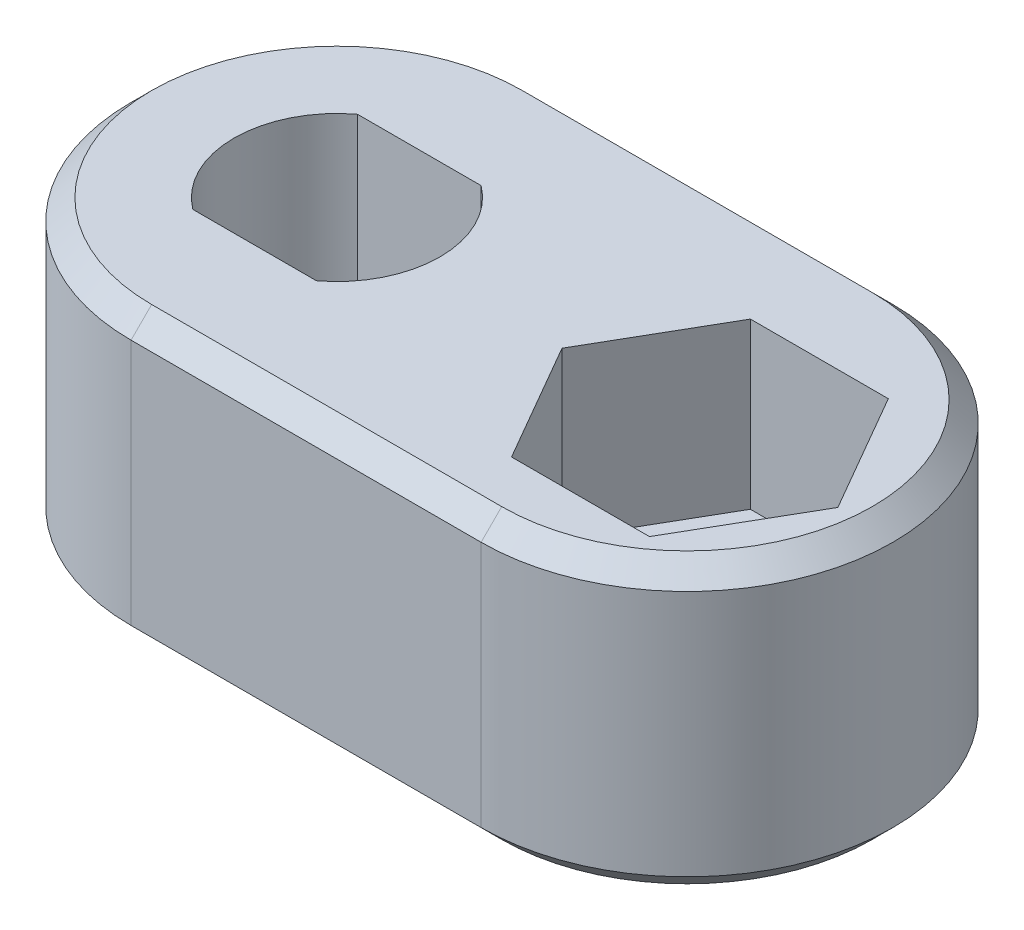
ISO-10303-21;
HEADER;
FILE_DESCRIPTION(('STEP AP214'),'2;1');
FILE_NAME('part.step','',(''),(''),'','','');
FILE_SCHEMA(('AUTOMOTIVE_DESIGN { 1 0 10303 214 1 1 1 1 }'));
ENDSEC;
DATA;
#1=APPLICATION_CONTEXT('core data for automotive mechanical design processes');
#2=APPLICATION_PROTOCOL_DEFINITION('international standard','automotive_design',2000,#1);
#3=PRODUCT_CONTEXT('',#1,'mechanical');
#4=PRODUCT('Part','Part','',(#3));
#5=PRODUCT_RELATED_PRODUCT_CATEGORY('part','',(#4));
#6=PRODUCT_DEFINITION_FORMATION('','',#4);
#7=PRODUCT_DEFINITION_CONTEXT('part definition',#1,'design');
#8=PRODUCT_DEFINITION('design','',#6,#7);
#9=PRODUCT_DEFINITION_SHAPE('','',#8);
#10=(LENGTH_UNIT() NAMED_UNIT(*) SI_UNIT(.MILLI.,.METRE.));
#11=(NAMED_UNIT(*) PLANE_ANGLE_UNIT() SI_UNIT($,.RADIAN.));
#12=(NAMED_UNIT(*) SI_UNIT($,.STERADIAN.) SOLID_ANGLE_UNIT());
#13=UNCERTAINTY_MEASURE_WITH_UNIT(LENGTH_MEASURE(1.E-05),#10,'distance_accuracy_value','');
#14=(GEOMETRIC_REPRESENTATION_CONTEXT(3) GLOBAL_UNCERTAINTY_ASSIGNED_CONTEXT((#13)) GLOBAL_UNIT_ASSIGNED_CONTEXT((#10,
#11,#12)) REPRESENTATION_CONTEXT('',''));
#15=CARTESIAN_POINT('',(0.,0.,0.));
#16=DIRECTION('',(0.,0.,1.));
#17=DIRECTION('',(1.,0.,0.));
#18=AXIS2_PLACEMENT_3D('',#15,#16,#17);
#19=CARTESIAN_POINT('',(5.,7.,0.436816997812618));
#20=DIRECTION('',(0.,1.,0.));
#21=DIRECTION('',(0.,0.,1.));
#22=AXIS2_PLACEMENT_3D('',#19,#20,#21);
#23=CYLINDRICAL_SURFACE('',#22,2.07500000000001);
#24=CARTESIAN_POINT('',(5.,0.,0.436816997812618));
#25=DIRECTION('',(0.,1.,0.));
#26=DIRECTION('',(0.,0.,1.));
#27=AXIS2_PLACEMENT_3D('',#24,#25,#26);
#28=CIRCLE('',#27,2.07500000000001);
#29=CARTESIAN_POINT('',(5.,0.,2.51181699781263));
#30=VERTEX_POINT('',#29);
#31=EDGE_CURVE('E227',#30,#30,#28,.T.);
#32=ORIENTED_EDGE('',*,*,#31,.F.);
#33=EDGE_LOOP('',(#32));
#34=FACE_BOUND('',#33,.T.);
#35=CARTESIAN_POINT('',(5.,3.,0.436816997812618));
#36=DIRECTION('',(0.,1.,0.));
#37=DIRECTION('',(0.,0.,1.));
#38=AXIS2_PLACEMENT_3D('',#35,#36,#37);
#39=CIRCLE('',#38,2.07500000000001);
#40=CARTESIAN_POINT('',(5.,3.,2.51181699781263));
#41=VERTEX_POINT('',#40);
#42=EDGE_CURVE('E219',#41,#41,#39,.F.);
#43=ORIENTED_EDGE('',*,*,#42,.F.);
#44=EDGE_LOOP('',(#43));
#45=FACE_BOUND('',#44,.T.);
#46=ADVANCED_FACE('F36',(#34,#45),#23,.F.);
#47=CARTESIAN_POINT('',(-4.25,7.,0.));
#48=DIRECTION('',(0.,-1.,0.));
#49=DIRECTION('',(0.,0.,-1.));
#50=AXIS2_PLACEMENT_3D('',#47,#48,#49);
#51=CYLINDRICAL_SURFACE('',#50,5.);
#52=DIRECTION('',(0.,-1.,0.));
#53=VECTOR('',#52,1.);
#54=CARTESIAN_POINT('',(-4.25,7.,-5.));
#55=LINE('',#54,#53);
#56=CARTESIAN_POINT('',(-4.25,6.5,-5.));
#57=VERTEX_POINT('',#56);
#58=CARTESIAN_POINT('',(-4.25,0.500000000000004,-5.));
#59=VERTEX_POINT('',#58);
#60=EDGE_CURVE('E258',#57,#59,#55,.T.);
#61=ORIENTED_EDGE('',*,*,#60,.T.);
#62=CARTESIAN_POINT('',(-4.25,0.500000000000004,0.));
#63=DIRECTION('',(0.,1.,0.));
#64=DIRECTION('',(0.,0.,1.));
#65=AXIS2_PLACEMENT_3D('',#62,#63,#64);
#66=CIRCLE('',#65,5.);
#67=CARTESIAN_POINT('',(-4.25,0.500000000000004,5.));
#68=VERTEX_POINT('',#67);
#69=EDGE_CURVE('E301',#59,#68,#66,.T.);
#70=ORIENTED_EDGE('',*,*,#69,.T.);
#71=DIRECTION('',(0.,-1.,0.));
#72=VECTOR('',#71,1.);
#73=CARTESIAN_POINT('',(-4.25,7.,5.));
#74=LINE('',#73,#72);
#75=CARTESIAN_POINT('',(-4.25,6.5,5.));
#76=VERTEX_POINT('',#75);
#77=EDGE_CURVE('E273',#76,#68,#74,.T.);
#78=ORIENTED_EDGE('',*,*,#77,.F.);
#79=CARTESIAN_POINT('',(-4.25,6.5,0.));
#80=DIRECTION('',(0.,1.,0.));
#81=DIRECTION('',(0.,0.,1.));
#82=AXIS2_PLACEMENT_3D('',#79,#80,#81);
#83=CIRCLE('',#82,5.);
#84=EDGE_CURVE('E299',#76,#57,#83,.F.);
#85=ORIENTED_EDGE('',*,*,#84,.T.);
#86=EDGE_LOOP('',(#61,#70,#78,#85));
#87=FACE_BOUND('',#86,.T.);
#88=ADVANCED_FACE('F367',(#87),#51,.T.);
#89=CARTESIAN_POINT('',(-4.25,7.,5.));
#90=DIRECTION('',(0.,0.,-1.));
#91=DIRECTION('',(-1.,0.,0.));
#92=AXIS2_PLACEMENT_3D('',#89,#90,#91);
#93=PLANE('',#92);
#94=ORIENTED_EDGE('',*,*,#77,.T.);
#95=DIRECTION('',(1.,0.,0.));
#96=VECTOR('',#95,1.);
#97=CARTESIAN_POINT('',(-4.25,0.500000000000004,5.));
#98=LINE('',#97,#96);
#99=CARTESIAN_POINT('',(4.25,0.500000000000004,5.));
#100=VERTEX_POINT('',#99);
#101=EDGE_CURVE('E283',#68,#100,#98,.T.);
#102=ORIENTED_EDGE('',*,*,#101,.T.);
#103=DIRECTION('',(0.,-1.,0.));
#104=VECTOR('',#103,1.);
#105=CARTESIAN_POINT('',(4.25,7.,5.));
#106=LINE('',#105,#104);
#107=CARTESIAN_POINT('',(4.25,6.5,5.));
#108=VERTEX_POINT('',#107);
#109=EDGE_CURVE('E270',#108,#100,#106,.T.);
#110=ORIENTED_EDGE('',*,*,#109,.F.);
#111=DIRECTION('',(-1.,0.,0.));
#112=VECTOR('',#111,1.);
#113=CARTESIAN_POINT('',(-4.25,6.5,5.));
#114=LINE('',#113,#112);
#115=EDGE_CURVE('E276',#108,#76,#114,.T.);
#116=ORIENTED_EDGE('',*,*,#115,.T.);
#117=EDGE_LOOP('',(#94,#102,#110,#116));
#118=FACE_BOUND('',#117,.T.);
#119=ADVANCED_FACE('F351',(#118),#93,.F.);
#120=CARTESIAN_POINT('',(4.25,7.,0.));
#121=DIRECTION('',(0.,-1.,0.));
#122=DIRECTION('',(0.,0.,-1.));
#123=AXIS2_PLACEMENT_3D('',#120,#121,#122);
#124=CYLINDRICAL_SURFACE('',#123,5.);
#125=ORIENTED_EDGE('',*,*,#109,.T.);
#126=CARTESIAN_POINT('',(4.25,0.500000000000004,0.));
#127=DIRECTION('',(0.,1.,0.));
#128=DIRECTION('',(0.,0.,1.));
#129=AXIS2_PLACEMENT_3D('',#126,#127,#128);
#130=CIRCLE('',#129,5.);
#131=CARTESIAN_POINT('',(4.25,0.500000000000004,-5.));
#132=VERTEX_POINT('',#131);
#133=EDGE_CURVE('E297',#100,#132,#130,.T.);
#134=ORIENTED_EDGE('',*,*,#133,.T.);
#135=DIRECTION('',(0.,-1.,0.));
#136=VECTOR('',#135,1.);
#137=CARTESIAN_POINT('',(4.25,7.,-5.));
#138=LINE('',#137,#136);
#139=CARTESIAN_POINT('',(4.25,6.5,-5.));
#140=VERTEX_POINT('',#139);
#141=EDGE_CURVE('E267',#140,#132,#138,.T.);
#142=ORIENTED_EDGE('',*,*,#141,.F.);
#143=CARTESIAN_POINT('',(4.25,6.5,0.));
#144=DIRECTION('',(0.,1.,0.));
#145=DIRECTION('',(0.,0.,1.));
#146=AXIS2_PLACEMENT_3D('',#143,#144,#145);
#147=CIRCLE('',#146,5.);
#148=EDGE_CURVE('E295',#140,#108,#147,.F.);
#149=ORIENTED_EDGE('',*,*,#148,.T.);
#150=EDGE_LOOP('',(#125,#134,#142,#149));
#151=FACE_BOUND('',#150,.T.);
#152=ADVANCED_FACE('F341',(#151),#124,.T.);
#153=CARTESIAN_POINT('',(-4.25,7.,-5.));
#154=DIRECTION('',(0.,0.,1.));
#155=DIRECTION('',(1.,0.,0.));
#156=AXIS2_PLACEMENT_3D('',#153,#154,#155);
#157=PLANE('',#156);
#158=ORIENTED_EDGE('',*,*,#141,.T.);
#159=DIRECTION('',(-1.,0.,0.));
#160=VECTOR('',#159,1.);
#161=CARTESIAN_POINT('',(-4.25,0.500000000000004,-5.));
#162=LINE('',#161,#160);
#163=EDGE_CURVE('E305',#132,#59,#162,.T.);
#164=ORIENTED_EDGE('',*,*,#163,.T.);
#165=ORIENTED_EDGE('',*,*,#60,.F.);
#166=DIRECTION('',(1.,0.,0.));
#167=VECTOR('',#166,1.);
#168=CARTESIAN_POINT('',(4.25,6.5,-5.));
#169=LINE('',#168,#167);
#170=EDGE_CURVE('E303',#57,#140,#169,.T.);
#171=ORIENTED_EDGE('',*,*,#170,.T.);
#172=EDGE_LOOP('',(#158,#164,#165,#171));
#173=FACE_BOUND('',#172,.T.);
#174=ADVANCED_FACE('F338',(#173),#157,.F.);
#175=CARTESIAN_POINT('',(-4.25,7.,0.));
#176=DIRECTION('',(0.,1.,0.));
#177=DIRECTION('',(0.,0.,1.));
#178=AXIS2_PLACEMENT_3D('',#175,#176,#177);
#179=PLANE('',#178);
#180=CARTESIAN_POINT('',(-4.25,7.,0.));
#181=DIRECTION('',(0.,1.,0.));
#182=DIRECTION('',(0.,0.,1.));
#183=AXIS2_PLACEMENT_3D('',#180,#181,#182);
#184=CIRCLE('',#183,4.5);
#185=CARTESIAN_POINT('',(-4.25,7.,-4.5));
#186=VERTEX_POINT('',#185);
#187=CARTESIAN_POINT('',(-4.25,7.,4.5));
#188=VERTEX_POINT('',#187);
#189=EDGE_CURVE('E61',#186,#188,#184,.T.);
#190=ORIENTED_EDGE('',*,*,#189,.T.);
#191=DIRECTION('',(1.,0.,0.));
#192=VECTOR('',#191,1.);
#193=CARTESIAN_POINT('',(4.25,7.,4.49999999999999));
#194=LINE('',#193,#192);
#195=CARTESIAN_POINT('',(4.25,7.,4.49999999999999));
#196=VERTEX_POINT('',#195);
#197=EDGE_CURVE('E11',#188,#196,#194,.T.);
#198=ORIENTED_EDGE('',*,*,#197,.T.);
#199=CARTESIAN_POINT('',(4.25,7.,0.));
#200=DIRECTION('',(0.,1.,0.));
#201=DIRECTION('',(0.,0.,1.));
#202=AXIS2_PLACEMENT_3D('',#199,#200,#201);
#203=CIRCLE('',#202,4.5);
#204=CARTESIAN_POINT('',(4.25,7.,-4.5));
#205=VERTEX_POINT('',#204);
#206=EDGE_CURVE('E46',#196,#205,#203,.T.);
#207=ORIENTED_EDGE('',*,*,#206,.T.);
#208=DIRECTION('',(-1.,0.,0.));
#209=VECTOR('',#208,1.);
#210=CARTESIAN_POINT('',(-4.25,7.,-4.5));
#211=LINE('',#210,#209);
#212=EDGE_CURVE('E307',#205,#186,#211,.T.);
#213=ORIENTED_EDGE('',*,*,#212,.T.);
#214=EDGE_LOOP('',(#190,#198,#207,#213));
#215=FACE_BOUND('',#214,.T.);
#216=DIRECTION('',(0.5,0.,-0.866025403784439));
#217=VECTOR('',#216,1.);
#218=CARTESIAN_POINT('',(6.67431578064445,7.,3.33681699781236));
#219=LINE('',#218,#217);
#220=CARTESIAN_POINT('',(6.67431578064445,7.,3.33681699781236));
#221=VERTEX_POINT('',#220);
#222=CARTESIAN_POINT('',(8.34863156129436,7.,0.436816997812368));
#223=VERTEX_POINT('',#222);
#224=EDGE_CURVE('E173',#221,#223,#219,.T.);
#225=ORIENTED_EDGE('',*,*,#224,.F.);
#226=DIRECTION('',(1.,0.,0.));
#227=VECTOR('',#226,1.);
#228=CARTESIAN_POINT('',(3.32568421934462,7.,3.33681699781236));
#229=LINE('',#228,#227);
#230=CARTESIAN_POINT('',(3.32568421934462,7.,3.33681699781236));
#231=VERTEX_POINT('',#230);
#232=EDGE_CURVE('E192',#231,#221,#229,.T.);
#233=ORIENTED_EDGE('',*,*,#232,.F.);
#234=DIRECTION('',(0.5,0.,0.866025403784439));
#235=VECTOR('',#234,1.);
#236=CARTESIAN_POINT('',(1.65136843869471,7.,0.436816997812369));
#237=LINE('',#236,#235);
#238=CARTESIAN_POINT('',(1.65136843869471,7.,0.436816997812369));
#239=VERTEX_POINT('',#238);
#240=EDGE_CURVE('E195',#239,#231,#237,.T.);
#241=ORIENTED_EDGE('',*,*,#240,.F.);
#242=DIRECTION('',(-0.5,0.,0.866025403784439));
#243=VECTOR('',#242,1.);
#244=CARTESIAN_POINT('',(3.32568421934462,7.,-2.46318300218763));
#245=LINE('',#244,#243);
#246=CARTESIAN_POINT('',(3.32568421934462,7.,-2.46318300218763));
#247=VERTEX_POINT('',#246);
#248=EDGE_CURVE('E212',#247,#239,#245,.T.);
#249=ORIENTED_EDGE('',*,*,#248,.F.);
#250=DIRECTION('',(-1.,0.,0.));
#251=VECTOR('',#250,1.);
#252=CARTESIAN_POINT('',(6.67431578064445,7.,-2.46318300218763));
#253=LINE('',#252,#251);
#254=CARTESIAN_POINT('',(6.67431578064445,7.,-2.46318300218763));
#255=VERTEX_POINT('',#254);
#256=EDGE_CURVE('E209',#255,#247,#253,.T.);
#257=ORIENTED_EDGE('',*,*,#256,.F.);
#258=DIRECTION('',(-0.5,0.,-0.866025403784439));
#259=VECTOR('',#258,1.);
#260=CARTESIAN_POINT('',(8.34863156129436,7.,0.436816997812367));
#261=LINE('',#260,#259);
#262=EDGE_CURVE('E206',#223,#255,#261,.T.);
#263=ORIENTED_EDGE('',*,*,#262,.F.);
#264=EDGE_LOOP('',(#225,#233,#241,#249,#257,#263));
#265=FACE_BOUND('',#264,.T.);
#266=CARTESIAN_POINT('',(-4.25,7.,0.));
#267=DIRECTION('',(0.,1.,0.));
#268=DIRECTION('',(0.,0.,1.));
#269=AXIS2_PLACEMENT_3D('',#266,#267,#268);
#270=CIRCLE('',#269,2.5);
#271=CARTESIAN_POINT('',(-5.75,7.,-2.));
#272=VERTEX_POINT('',#271);
#273=CARTESIAN_POINT('',(-5.75,7.,2.));
#274=VERTEX_POINT('',#273);
#275=EDGE_CURVE('E248',#272,#274,#270,.T.);
#276=ORIENTED_EDGE('',*,*,#275,.F.);
#277=DIRECTION('',(1.,0.,0.));
#278=VECTOR('',#277,1.);
#279=CARTESIAN_POINT('',(0.,7.,-2.));
#280=LINE('',#279,#278);
#281=CARTESIAN_POINT('',(-2.75,7.,-2.));
#282=VERTEX_POINT('',#281);
#283=EDGE_CURVE('E241',#272,#282,#280,.T.);
#284=ORIENTED_EDGE('',*,*,#283,.T.);
#285=CARTESIAN_POINT('',(-2.75,7.,2.));
#286=VERTEX_POINT('',#285);
#287=EDGE_CURVE('E251',#286,#282,#270,.T.);
#288=ORIENTED_EDGE('',*,*,#287,.F.);
#289=DIRECTION('',(1.,0.,0.));
#290=VECTOR('',#289,1.);
#291=CARTESIAN_POINT('',(0.,7.,2.));
#292=LINE('',#291,#290);
#293=EDGE_CURVE('E250',#274,#286,#292,.T.);
#294=ORIENTED_EDGE('',*,*,#293,.F.);
#295=EDGE_LOOP('',(#276,#284,#288,#294));
#296=FACE_BOUND('',#295,.T.);
#297=ADVANCED_FACE('F416',(#215,#265,#296),#179,.T.);
#298=CARTESIAN_POINT('',(-4.25,0.,0.));
#299=DIRECTION('',(0.,1.,0.));
#300=DIRECTION('',(0.,0.,1.));
#301=AXIS2_PLACEMENT_3D('',#298,#299,#300);
#302=PLANE('',#301);
#303=CARTESIAN_POINT('',(4.25,0.,0.));
#304=DIRECTION('',(0.,1.,0.));
#305=DIRECTION('',(0.,0.,1.));
#306=AXIS2_PLACEMENT_3D('',#303,#304,#305);
#307=CIRCLE('',#306,4.5);
#308=CARTESIAN_POINT('',(4.25,0.,-4.5));
#309=VERTEX_POINT('',#308);
#310=CARTESIAN_POINT('',(4.25,0.,4.49999999999999));
#311=VERTEX_POINT('',#310);
#312=EDGE_CURVE('E290',#309,#311,#307,.F.);
#313=ORIENTED_EDGE('',*,*,#312,.T.);
#314=DIRECTION('',(-1.,0.,0.));
#315=VECTOR('',#314,1.);
#316=CARTESIAN_POINT('',(-4.25,0.,4.5));
#317=LINE('',#316,#315);
#318=CARTESIAN_POINT('',(-4.25,0.,4.5));
#319=VERTEX_POINT('',#318);
#320=EDGE_CURVE('E292',#311,#319,#317,.T.);
#321=ORIENTED_EDGE('',*,*,#320,.T.);
#322=CARTESIAN_POINT('',(-4.25,0.,0.));
#323=DIRECTION('',(0.,1.,0.));
#324=DIRECTION('',(0.,0.,1.));
#325=AXIS2_PLACEMENT_3D('',#322,#323,#324);
#326=CIRCLE('',#325,4.5);
#327=CARTESIAN_POINT('',(-4.25,0.,-4.5));
#328=VERTEX_POINT('',#327);
#329=EDGE_CURVE('E288',#319,#328,#326,.F.);
#330=ORIENTED_EDGE('',*,*,#329,.T.);
#331=DIRECTION('',(1.,0.,0.));
#332=VECTOR('',#331,1.);
#333=CARTESIAN_POINT('',(-4.25,0.,-4.5));
#334=LINE('',#333,#332);
#335=EDGE_CURVE('E286',#328,#309,#334,.T.);
#336=ORIENTED_EDGE('',*,*,#335,.T.);
#337=EDGE_LOOP('',(#313,#321,#330,#336));
#338=FACE_BOUND('',#337,.T.);
#339=ORIENTED_EDGE('',*,*,#31,.T.);
#340=EDGE_LOOP('',(#339));
#341=FACE_BOUND('',#340,.T.);
#342=CARTESIAN_POINT('',(-4.25,0.,0.));
#343=DIRECTION('',(0.,-1.,0.));
#344=DIRECTION('',(0.,0.,-1.));
#345=AXIS2_PLACEMENT_3D('',#342,#343,#344);
#346=CIRCLE('',#345,3.36);
#347=CARTESIAN_POINT('',(-4.25,0.,-3.36));
#348=VERTEX_POINT('',#347);
#349=EDGE_CURVE('E230',#348,#348,#346,.T.);
#350=ORIENTED_EDGE('',*,*,#349,.F.);
#351=EDGE_LOOP('',(#350));
#352=FACE_BOUND('',#351,.T.);
#353=ADVANCED_FACE('F359',(#338,#341,#352),#302,.F.);
#354=CARTESIAN_POINT('',(-4.25,3.,0.));
#355=DIRECTION('',(0.,1.,0.));
#356=DIRECTION('',(0.,0.,1.));
#357=AXIS2_PLACEMENT_3D('',#354,#355,#356);
#358=CYLINDRICAL_SURFACE('',#357,2.5);
#359=ORIENTED_EDGE('',*,*,#275,.T.);
#360=DIRECTION('',(0.,1.,0.));
#361=VECTOR('',#360,1.);
#362=CARTESIAN_POINT('',(-5.75,3.,2.));
#363=LINE('',#362,#361);
#364=CARTESIAN_POINT('',(-5.75,3.,2.));
#365=VERTEX_POINT('',#364);
#366=EDGE_CURVE('E247',#365,#274,#363,.T.);
#367=ORIENTED_EDGE('',*,*,#366,.F.);
#368=CARTESIAN_POINT('',(-4.25,3.,0.));
#369=DIRECTION('',(0.,1.,0.));
#370=DIRECTION('',(0.,0.,1.));
#371=AXIS2_PLACEMENT_3D('',#368,#369,#370);
#372=CIRCLE('',#371,2.5);
#373=CARTESIAN_POINT('',(-5.75,3.,-2.));
#374=VERTEX_POINT('',#373);
#375=EDGE_CURVE('E237',#374,#365,#372,.T.);
#376=ORIENTED_EDGE('',*,*,#375,.F.);
#377=DIRECTION('',(0.,1.,0.));
#378=VECTOR('',#377,1.);
#379=CARTESIAN_POINT('',(-5.75,3.,-2.));
#380=LINE('',#379,#378);
#381=EDGE_CURVE('E256',#374,#272,#380,.T.);
#382=ORIENTED_EDGE('',*,*,#381,.T.);
#383=EDGE_LOOP('',(#359,#367,#376,#382));
#384=FACE_BOUND('',#383,.T.);
#385=ADVANCED_FACE('F408',(#384),#358,.F.);
#386=CARTESIAN_POINT('',(0.,3.,-2.));
#387=DIRECTION('',(0.,0.,1.));
#388=DIRECTION('',(1.,0.,0.));
#389=AXIS2_PLACEMENT_3D('',#386,#387,#388);
#390=PLANE('',#389);
#391=ORIENTED_EDGE('',*,*,#283,.F.);
#392=ORIENTED_EDGE('',*,*,#381,.F.);
#393=DIRECTION('',(1.,0.,0.));
#394=VECTOR('',#393,1.);
#395=CARTESIAN_POINT('',(0.,3.,-2.));
#396=LINE('',#395,#394);
#397=CARTESIAN_POINT('',(-2.75,3.,-2.));
#398=VERTEX_POINT('',#397);
#399=EDGE_CURVE('E245',#374,#398,#396,.T.);
#400=ORIENTED_EDGE('',*,*,#399,.T.);
#401=DIRECTION('',(0.,1.,0.));
#402=VECTOR('',#401,1.);
#403=CARTESIAN_POINT('',(-2.75,3.,-2.));
#404=LINE('',#403,#402);
#405=EDGE_CURVE('E259',#398,#282,#404,.T.);
#406=ORIENTED_EDGE('',*,*,#405,.T.);
#407=EDGE_LOOP('',(#391,#392,#400,#406));
#408=FACE_BOUND('',#407,.T.);
#409=ADVANCED_FACE('F404',(#408),#390,.T.);
#410=ORIENTED_EDGE('',*,*,#287,.T.);
#411=ORIENTED_EDGE('',*,*,#405,.F.);
#412=CARTESIAN_POINT('',(-2.75,3.,2.));
#413=VERTEX_POINT('',#412);
#414=EDGE_CURVE('E242',#413,#398,#372,.T.);
#415=ORIENTED_EDGE('',*,*,#414,.F.);
#416=DIRECTION('',(0.,1.,0.));
#417=VECTOR('',#416,1.);
#418=CARTESIAN_POINT('',(-2.75,3.,2.));
#419=LINE('',#418,#417);
#420=EDGE_CURVE('E261',#413,#286,#419,.T.);
#421=ORIENTED_EDGE('',*,*,#420,.T.);
#422=EDGE_LOOP('',(#410,#411,#415,#421));
#423=FACE_BOUND('',#422,.T.);
#424=ADVANCED_FACE('F407',(#423),#358,.F.);
#425=CARTESIAN_POINT('',(0.,3.,2.));
#426=DIRECTION('',(0.,0.,1.));
#427=DIRECTION('',(1.,0.,0.));
#428=AXIS2_PLACEMENT_3D('',#425,#426,#427);
#429=PLANE('',#428);
#430=ORIENTED_EDGE('',*,*,#293,.T.);
#431=ORIENTED_EDGE('',*,*,#420,.F.);
#432=DIRECTION('',(1.,0.,0.));
#433=VECTOR('',#432,1.);
#434=CARTESIAN_POINT('',(0.,3.,2.));
#435=LINE('',#434,#433);
#436=EDGE_CURVE('E240',#365,#413,#435,.T.);
#437=ORIENTED_EDGE('',*,*,#436,.F.);
#438=ORIENTED_EDGE('',*,*,#366,.T.);
#439=EDGE_LOOP('',(#430,#431,#437,#438));
#440=FACE_BOUND('',#439,.T.);
#441=ADVANCED_FACE('F402',(#440),#429,.F.);
#442=CARTESIAN_POINT('',(0.,3.,0.));
#443=DIRECTION('',(0.,1.,0.));
#444=DIRECTION('',(0.,0.,1.));
#445=AXIS2_PLACEMENT_3D('',#442,#443,#444);
#446=PLANE('',#445);
#447=CARTESIAN_POINT('',(-4.25,3.,0.));
#448=DIRECTION('',(0.,1.,0.));
#449=DIRECTION('',(0.,0.,1.));
#450=AXIS2_PLACEMENT_3D('',#447,#448,#449);
#451=CIRCLE('',#450,1.7);
#452=CARTESIAN_POINT('',(-4.25,3.,1.7));
#453=VERTEX_POINT('',#452);
#454=EDGE_CURVE('E236',#453,#453,#451,.T.);
#455=ORIENTED_EDGE('',*,*,#454,.F.);
#456=EDGE_LOOP('',(#455));
#457=FACE_BOUND('',#456,.T.);
#458=ORIENTED_EDGE('',*,*,#375,.T.);
#459=ORIENTED_EDGE('',*,*,#436,.T.);
#460=ORIENTED_EDGE('',*,*,#414,.T.);
#461=ORIENTED_EDGE('',*,*,#399,.F.);
#462=EDGE_LOOP('',(#458,#459,#460,#461));
#463=FACE_BOUND('',#462,.T.);
#464=ADVANCED_FACE('F398',(#457,#463),#446,.T.);
#465=CARTESIAN_POINT('',(-4.25,0.,0.));
#466=DIRECTION('',(0.,-1.,0.));
#467=DIRECTION('',(0.,0.,-1.));
#468=AXIS2_PLACEMENT_3D('',#465,#466,#467);
#469=CYLINDRICAL_SURFACE('',#468,1.7);
#470=ORIENTED_EDGE('',*,*,#454,.T.);
#471=EDGE_LOOP('',(#470));
#472=FACE_BOUND('',#471,.T.);
#473=CARTESIAN_POINT('',(-4.25,1.66,0.));
#474=DIRECTION('',(0.,-1.,0.));
#475=DIRECTION('',(0.,0.,-1.));
#476=AXIS2_PLACEMENT_3D('',#473,#474,#475);
#477=CIRCLE('',#476,1.7);
#478=CARTESIAN_POINT('',(-4.25,1.66,-1.7));
#479=VERTEX_POINT('',#478);
#480=EDGE_CURVE('E233',#479,#479,#477,.T.);
#481=ORIENTED_EDGE('',*,*,#480,.T.);
#482=EDGE_LOOP('',(#481));
#483=FACE_BOUND('',#482,.T.);
#484=ADVANCED_FACE('F394',(#472,#483),#469,.F.);
#485=CARTESIAN_POINT('',(-4.25,0.,0.));
#486=DIRECTION('',(0.,-1.,0.));
#487=DIRECTION('',(0.,0.,-1.));
#488=AXIS2_PLACEMENT_3D('',#485,#486,#487);
#489=CONICAL_SURFACE('',#488,3.36,0.785398163397448);
#490=ORIENTED_EDGE('',*,*,#480,.F.);
#491=EDGE_LOOP('',(#490));
#492=FACE_BOUND('',#491,.T.);
#493=ORIENTED_EDGE('',*,*,#349,.T.);
#494=EDGE_LOOP('',(#493));
#495=FACE_BOUND('',#494,.T.);
#496=ADVANCED_FACE('F391',(#492,#495),#489,.F.);
#497=CARTESIAN_POINT('',(0.,3.,0.));
#498=DIRECTION('',(0.,1.,0.));
#499=DIRECTION('',(0.,0.,1.));
#500=AXIS2_PLACEMENT_3D('',#497,#498,#499);
#501=PLANE('',#500);
#502=DIRECTION('',(0.5,0.,-0.866025403784439));
#503=VECTOR('',#502,1.);
#504=CARTESIAN_POINT('',(6.67431578064445,3.,3.33681699781236));
#505=LINE('',#504,#503);
#506=CARTESIAN_POINT('',(6.67431578064445,3.,3.33681699781236));
#507=VERTEX_POINT('',#506);
#508=CARTESIAN_POINT('',(8.34863156129436,3.,0.436816997812367));
#509=VERTEX_POINT('',#508);
#510=EDGE_CURVE('E170',#507,#509,#505,.T.);
#511=ORIENTED_EDGE('',*,*,#510,.T.);
#512=DIRECTION('',(-0.5,0.,-0.866025403784439));
#513=VECTOR('',#512,1.);
#514=CARTESIAN_POINT('',(8.34863156129436,3.,0.436816997812367));
#515=LINE('',#514,#513);
#516=CARTESIAN_POINT('',(6.67431578064445,3.,-2.46318300218763));
#517=VERTEX_POINT('',#516);
#518=EDGE_CURVE('E181',#509,#517,#515,.T.);
#519=ORIENTED_EDGE('',*,*,#518,.T.);
#520=DIRECTION('',(-1.,0.,0.));
#521=VECTOR('',#520,1.);
#522=CARTESIAN_POINT('',(6.67431578064445,3.,-2.46318300218763));
#523=LINE('',#522,#521);
#524=CARTESIAN_POINT('',(3.32568421934462,3.,-2.46318300218763));
#525=VERTEX_POINT('',#524);
#526=EDGE_CURVE('E186',#517,#525,#523,.T.);
#527=ORIENTED_EDGE('',*,*,#526,.T.);
#528=DIRECTION('',(-0.5,0.,0.866025403784439));
#529=VECTOR('',#528,1.);
#530=CARTESIAN_POINT('',(3.32568421934462,3.,-2.46318300218763));
#531=LINE('',#530,#529);
#532=CARTESIAN_POINT('',(1.65136843869471,3.,0.436816997812369));
#533=VERTEX_POINT('',#532);
#534=EDGE_CURVE('E199',#525,#533,#531,.T.);
#535=ORIENTED_EDGE('',*,*,#534,.T.);
#536=DIRECTION('',(0.5,0.,0.866025403784439));
#537=VECTOR('',#536,1.);
#538=CARTESIAN_POINT('',(1.65136843869471,3.,0.436816997812369));
#539=LINE('',#538,#537);
#540=CARTESIAN_POINT('',(3.32568421934462,3.,3.33681699781236));
#541=VERTEX_POINT('',#540);
#542=EDGE_CURVE('E202',#533,#541,#539,.T.);
#543=ORIENTED_EDGE('',*,*,#542,.T.);
#544=DIRECTION('',(1.,0.,0.));
#545=VECTOR('',#544,1.);
#546=CARTESIAN_POINT('',(3.32568421934462,3.,3.33681699781236));
#547=LINE('',#546,#545);
#548=EDGE_CURVE('E178',#541,#507,#547,.T.);
#549=ORIENTED_EDGE('',*,*,#548,.T.);
#550=EDGE_LOOP('',(#511,#519,#527,#535,#543,#549));
#551=FACE_BOUND('',#550,.T.);
#552=ORIENTED_EDGE('',*,*,#42,.T.);
#553=EDGE_LOOP('',(#552));
#554=FACE_BOUND('',#553,.T.);
#555=ADVANCED_FACE('F188',(#551,#554),#501,.T.);
#556=CARTESIAN_POINT('',(6.67431578064445,3.,3.33681699781236));
#557=DIRECTION('',(0.866025403784439,0.,0.5));
#558=DIRECTION('',(0.5,0.,-0.866025403784439));
#559=AXIS2_PLACEMENT_3D('',#556,#557,#558);
#560=PLANE('',#559);
#561=ORIENTED_EDGE('',*,*,#224,.T.);
#562=DIRECTION('',(0.,1.,0.));
#563=VECTOR('',#562,1.);
#564=CARTESIAN_POINT('',(8.34863156129436,3.,0.436816997812367));
#565=LINE('',#564,#563);
#566=EDGE_CURVE('E166',#509,#223,#565,.T.);
#567=ORIENTED_EDGE('',*,*,#566,.F.);
#568=ORIENTED_EDGE('',*,*,#510,.F.);
#569=DIRECTION('',(0.,1.,0.));
#570=VECTOR('',#569,1.);
#571=CARTESIAN_POINT('',(6.67431578064445,3.,3.33681699781236));
#572=LINE('',#571,#570);
#573=EDGE_CURVE('E217',#507,#221,#572,.T.);
#574=ORIENTED_EDGE('',*,*,#573,.T.);
#575=EDGE_LOOP('',(#561,#567,#568,#574));
#576=FACE_BOUND('',#575,.T.);
#577=ADVANCED_FACE('F168',(#576),#560,.F.);
#578=CARTESIAN_POINT('',(3.32568421934462,3.,3.33681699781236));
#579=DIRECTION('',(0.,0.,1.));
#580=DIRECTION('',(1.,0.,0.));
#581=AXIS2_PLACEMENT_3D('',#578,#579,#580);
#582=PLANE('',#581);
#583=ORIENTED_EDGE('',*,*,#232,.T.);
#584=ORIENTED_EDGE('',*,*,#573,.F.);
#585=ORIENTED_EDGE('',*,*,#548,.F.);
#586=DIRECTION('',(0.,1.,0.));
#587=VECTOR('',#586,1.);
#588=CARTESIAN_POINT('',(3.32568421934462,3.,3.33681699781236));
#589=LINE('',#588,#587);
#590=EDGE_CURVE('E220',#541,#231,#589,.T.);
#591=ORIENTED_EDGE('',*,*,#590,.T.);
#592=EDGE_LOOP('',(#583,#584,#585,#591));
#593=FACE_BOUND('',#592,.T.);
#594=ADVANCED_FACE('F553',(#593),#582,.F.);
#595=CARTESIAN_POINT('',(1.65136843869471,3.,0.436816997812369));
#596=DIRECTION('',(-0.866025403784439,0.,0.5));
#597=DIRECTION('',(0.5,0.,0.866025403784439));
#598=AXIS2_PLACEMENT_3D('',#595,#596,#597);
#599=PLANE('',#598);
#600=ORIENTED_EDGE('',*,*,#240,.T.);
#601=ORIENTED_EDGE('',*,*,#590,.F.);
#602=ORIENTED_EDGE('',*,*,#542,.F.);
#603=DIRECTION('',(0.,1.,0.));
#604=VECTOR('',#603,1.);
#605=CARTESIAN_POINT('',(1.65136843869471,3.,0.436816997812369));
#606=LINE('',#605,#604);
#607=EDGE_CURVE('E222',#533,#239,#606,.T.);
#608=ORIENTED_EDGE('',*,*,#607,.T.);
#609=EDGE_LOOP('',(#600,#601,#602,#608));
#610=FACE_BOUND('',#609,.T.);
#611=ADVANCED_FACE('F543',(#610),#599,.F.);
#612=CARTESIAN_POINT('',(3.32568421934462,3.,-2.46318300218763));
#613=DIRECTION('',(-0.866025403784439,0.,-0.5));
#614=DIRECTION('',(-0.5,0.,0.866025403784439));
#615=AXIS2_PLACEMENT_3D('',#612,#613,#614);
#616=PLANE('',#615);
#617=ORIENTED_EDGE('',*,*,#248,.T.);
#618=ORIENTED_EDGE('',*,*,#607,.F.);
#619=ORIENTED_EDGE('',*,*,#534,.F.);
#620=DIRECTION('',(0.,1.,0.));
#621=VECTOR('',#620,1.);
#622=CARTESIAN_POINT('',(3.32568421934462,3.,-2.46318300218763));
#623=LINE('',#622,#621);
#624=EDGE_CURVE('E224',#525,#247,#623,.T.);
#625=ORIENTED_EDGE('',*,*,#624,.T.);
#626=EDGE_LOOP('',(#617,#618,#619,#625));
#627=FACE_BOUND('',#626,.T.);
#628=ADVANCED_FACE('F533',(#627),#616,.F.);
#629=CARTESIAN_POINT('',(6.67431578064445,3.,-2.46318300218763));
#630=DIRECTION('',(0.,0.,-1.));
#631=DIRECTION('',(-1.,0.,0.));
#632=AXIS2_PLACEMENT_3D('',#629,#630,#631);
#633=PLANE('',#632);
#634=ORIENTED_EDGE('',*,*,#256,.T.);
#635=ORIENTED_EDGE('',*,*,#624,.F.);
#636=ORIENTED_EDGE('',*,*,#526,.F.);
#637=DIRECTION('',(0.,1.,0.));
#638=VECTOR('',#637,1.);
#639=CARTESIAN_POINT('',(6.67431578064445,3.,-2.46318300218763));
#640=LINE('',#639,#638);
#641=EDGE_CURVE('E177',#517,#255,#640,.T.);
#642=ORIENTED_EDGE('',*,*,#641,.T.);
#643=EDGE_LOOP('',(#634,#635,#636,#642));
#644=FACE_BOUND('',#643,.T.);
#645=ADVANCED_FACE('F525',(#644),#633,.F.);
#646=CARTESIAN_POINT('',(8.34863156129436,3.,0.436816997812367));
#647=DIRECTION('',(0.866025403784439,0.,-0.5));
#648=DIRECTION('',(-0.5,0.,-0.866025403784439));
#649=AXIS2_PLACEMENT_3D('',#646,#647,#648);
#650=PLANE('',#649);
#651=ORIENTED_EDGE('',*,*,#262,.T.);
#652=ORIENTED_EDGE('',*,*,#641,.F.);
#653=ORIENTED_EDGE('',*,*,#518,.F.);
#654=ORIENTED_EDGE('',*,*,#566,.T.);
#655=EDGE_LOOP('',(#651,#652,#653,#654));
#656=FACE_BOUND('',#655,.T.);
#657=ADVANCED_FACE('F182',(#656),#650,.F.);
#658=CARTESIAN_POINT('',(-4.25,0.500000000000004,-5.));
#659=DIRECTION('',(0.,0.707106781186547,0.707106781186547));
#660=DIRECTION('',(-1.,0.,0.));
#661=AXIS2_PLACEMENT_3D('',#658,#659,#660);
#662=PLANE('',#661);
#663=DIRECTION('',(0.,0.707106781186547,-0.707106781186547));
#664=VECTOR('',#663,1.);
#665=CARTESIAN_POINT('',(4.25,0.,-4.5));
#666=LINE('',#665,#664);
#667=EDGE_CURVE('E315',#309,#132,#666,.T.);
#668=ORIENTED_EDGE('',*,*,#667,.F.);
#669=ORIENTED_EDGE('',*,*,#335,.F.);
#670=DIRECTION('',(0.,-0.707106781186547,0.707106781186547));
#671=VECTOR('',#670,1.);
#672=CARTESIAN_POINT('',(-4.25,0.500000000000004,-5.));
#673=LINE('',#672,#671);
#674=EDGE_CURVE('E207',#59,#328,#673,.T.);
#675=ORIENTED_EDGE('',*,*,#674,.F.);
#676=ORIENTED_EDGE('',*,*,#163,.F.);
#677=EDGE_LOOP('',(#668,#669,#675,#676));
#678=FACE_BOUND('',#677,.T.);
#679=ADVANCED_FACE('F364',(#678),#662,.F.);
#680=CARTESIAN_POINT('',(-4.25,0.500000000000004,0.));
#681=DIRECTION('',(0.,1.,0.));
#682=DIRECTION('',(0.,0.,1.));
#683=AXIS2_PLACEMENT_3D('',#680,#681,#682);
#684=CONICAL_SURFACE('',#683,5.,0.785398163397448);
#685=ORIENTED_EDGE('',*,*,#674,.T.);
#686=ORIENTED_EDGE('',*,*,#329,.F.);
#687=DIRECTION('',(0.,-0.707106781186547,-0.707106781186547));
#688=VECTOR('',#687,1.);
#689=CARTESIAN_POINT('',(-4.25,0.500000000000004,5.));
#690=LINE('',#689,#688);
#691=EDGE_CURVE('E313',#68,#319,#690,.T.);
#692=ORIENTED_EDGE('',*,*,#691,.F.);
#693=ORIENTED_EDGE('',*,*,#69,.F.);
#694=EDGE_LOOP('',(#685,#686,#692,#693));
#695=FACE_BOUND('',#694,.T.);
#696=ADVANCED_FACE('F369',(#695),#684,.T.);
#697=CARTESIAN_POINT('',(4.25,0.500000000000004,0.));
#698=DIRECTION('',(0.,1.,0.));
#699=DIRECTION('',(0.,0.,1.));
#700=AXIS2_PLACEMENT_3D('',#697,#698,#699);
#701=CONICAL_SURFACE('',#700,5.,0.785398163397448);
#702=ORIENTED_EDGE('',*,*,#667,.T.);
#703=ORIENTED_EDGE('',*,*,#133,.F.);
#704=DIRECTION('',(0.,0.707106781186547,0.707106781186547));
#705=VECTOR('',#704,1.);
#706=CARTESIAN_POINT('',(4.25,0.,4.49999999999999));
#707=LINE('',#706,#705);
#708=EDGE_CURVE('E311',#311,#100,#707,.T.);
#709=ORIENTED_EDGE('',*,*,#708,.F.);
#710=ORIENTED_EDGE('',*,*,#312,.F.);
#711=EDGE_LOOP('',(#702,#703,#709,#710));
#712=FACE_BOUND('',#711,.T.);
#713=ADVANCED_FACE('F346',(#712),#701,.T.);
#714=CARTESIAN_POINT('',(-4.25,0.500000000000004,5.));
#715=DIRECTION('',(0.,0.707106781186547,-0.707106781186547));
#716=DIRECTION('',(1.,0.,0.));
#717=AXIS2_PLACEMENT_3D('',#714,#715,#716);
#718=PLANE('',#717);
#719=ORIENTED_EDGE('',*,*,#691,.T.);
#720=ORIENTED_EDGE('',*,*,#320,.F.);
#721=ORIENTED_EDGE('',*,*,#708,.T.);
#722=ORIENTED_EDGE('',*,*,#101,.F.);
#723=EDGE_LOOP('',(#719,#720,#721,#722));
#724=FACE_BOUND('',#723,.T.);
#725=ADVANCED_FACE('F355',(#724),#718,.F.);
#726=CARTESIAN_POINT('',(-4.25,7.,-4.5));
#727=DIRECTION('',(0.,0.707106781186547,-0.707106781186547));
#728=DIRECTION('',(1.,0.,0.));
#729=AXIS2_PLACEMENT_3D('',#726,#727,#728);
#730=PLANE('',#729);
#731=DIRECTION('',(0.,0.707106781186547,0.707106781186547));
#732=VECTOR('',#731,1.);
#733=CARTESIAN_POINT('',(4.25,6.5,-5.));
#734=LINE('',#733,#732);
#735=EDGE_CURVE('E322',#140,#205,#734,.T.);
#736=ORIENTED_EDGE('',*,*,#735,.F.);
#737=ORIENTED_EDGE('',*,*,#170,.F.);
#738=DIRECTION('',(0.,-0.707106781186547,-0.707106781186547));
#739=VECTOR('',#738,1.);
#740=CARTESIAN_POINT('',(-4.25,7.,-4.5));
#741=LINE('',#740,#739);
#742=EDGE_CURVE('E41',#186,#57,#741,.T.);
#743=ORIENTED_EDGE('',*,*,#742,.F.);
#744=ORIENTED_EDGE('',*,*,#212,.F.);
#745=EDGE_LOOP('',(#736,#737,#743,#744));
#746=FACE_BOUND('',#745,.T.);
#747=ADVANCED_FACE('F39',(#746),#730,.T.);
#748=CARTESIAN_POINT('',(-4.25,7.,0.));
#749=DIRECTION('',(0.,-1.,0.));
#750=DIRECTION('',(0.,0.,-1.));
#751=AXIS2_PLACEMENT_3D('',#748,#749,#750);
#752=CONICAL_SURFACE('',#751,4.5,0.785398163397448);
#753=ORIENTED_EDGE('',*,*,#742,.T.);
#754=ORIENTED_EDGE('',*,*,#84,.F.);
#755=DIRECTION('',(0.,-0.707106781186547,0.707106781186547));
#756=VECTOR('',#755,1.);
#757=CARTESIAN_POINT('',(-4.25,7.,4.5));
#758=LINE('',#757,#756);
#759=EDGE_CURVE('E321',#188,#76,#758,.T.);
#760=ORIENTED_EDGE('',*,*,#759,.F.);
#761=ORIENTED_EDGE('',*,*,#189,.F.);
#762=EDGE_LOOP('',(#753,#754,#760,#761));
#763=FACE_BOUND('',#762,.T.);
#764=ADVANCED_FACE('F331',(#763),#752,.T.);
#765=CARTESIAN_POINT('',(4.25,7.,0.));
#766=DIRECTION('',(0.,-1.,0.));
#767=DIRECTION('',(0.,0.,-1.));
#768=AXIS2_PLACEMENT_3D('',#765,#766,#767);
#769=CONICAL_SURFACE('',#768,4.5,0.785398163397448);
#770=ORIENTED_EDGE('',*,*,#735,.T.);
#771=ORIENTED_EDGE('',*,*,#206,.F.);
#772=DIRECTION('',(0.,0.707106781186547,-0.707106781186547));
#773=VECTOR('',#772,1.);
#774=CARTESIAN_POINT('',(4.25,6.5,5.));
#775=LINE('',#774,#773);
#776=EDGE_CURVE('E54',#108,#196,#775,.T.);
#777=ORIENTED_EDGE('',*,*,#776,.F.);
#778=ORIENTED_EDGE('',*,*,#148,.F.);
#779=EDGE_LOOP('',(#770,#771,#777,#778));
#780=FACE_BOUND('',#779,.T.);
#781=ADVANCED_FACE('F447',(#780),#769,.T.);
#782=CARTESIAN_POINT('',(-4.25,7.,4.5));
#783=DIRECTION('',(0.,0.707106781186547,0.707106781186547));
#784=DIRECTION('',(-1.,0.,0.));
#785=AXIS2_PLACEMENT_3D('',#782,#783,#784);
#786=PLANE('',#785);
#787=ORIENTED_EDGE('',*,*,#759,.T.);
#788=ORIENTED_EDGE('',*,*,#115,.F.);
#789=ORIENTED_EDGE('',*,*,#776,.T.);
#790=ORIENTED_EDGE('',*,*,#197,.F.);
#791=EDGE_LOOP('',(#787,#788,#789,#790));
#792=FACE_BOUND('',#791,.T.);
#793=ADVANCED_FACE('F441',(#792),#786,.T.);
#794=CLOSED_SHELL('',(#46,#88,#119,#152,#174,#297,#353,#385,#409,#424,#441,#464,#484,#496,#555,
#577,#594,#611,#628,#645,#657,#679,#696,#713,#725,#747,#764,#781,#793));
#795=MANIFOLD_SOLID_BREP('B2',#794);
#796=ADVANCED_BREP_SHAPE_REPRESENTATION('',(#18,#795),#14);
#797=SHAPE_DEFINITION_REPRESENTATION(#9,#796);
ENDSEC;
END-ISO-10303-21;
